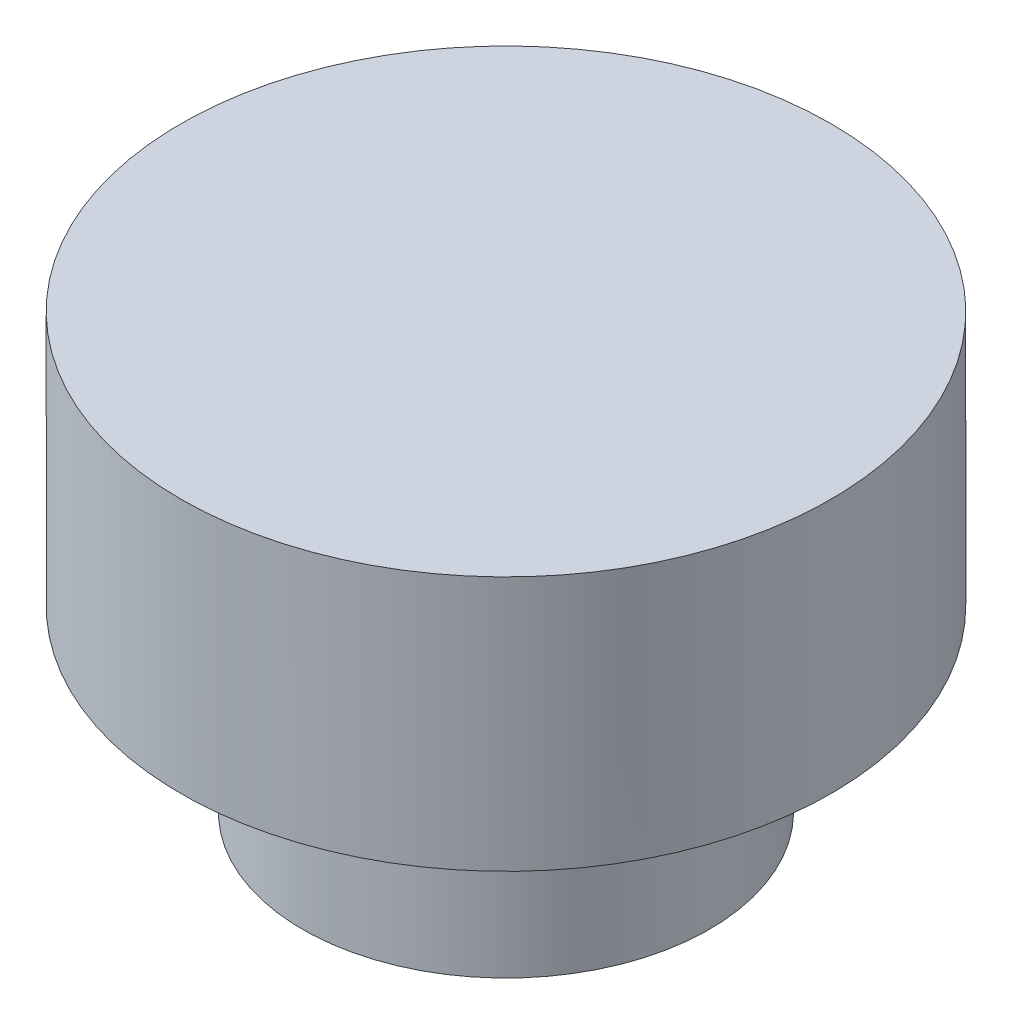
ISO-10303-21;
HEADER;
FILE_DESCRIPTION(('STEP AP214'),'2;1');
FILE_NAME('part.step','',(''),(''),'','','');
FILE_SCHEMA(('AUTOMOTIVE_DESIGN { 1 0 10303 214 1 1 1 1 }'));
ENDSEC;
DATA;
#1=APPLICATION_CONTEXT('core data for automotive mechanical design processes');
#2=APPLICATION_PROTOCOL_DEFINITION('international standard','automotive_design',2000,#1);
#3=PRODUCT_CONTEXT('',#1,'mechanical');
#4=PRODUCT('Part','Part','',(#3));
#5=PRODUCT_RELATED_PRODUCT_CATEGORY('part','',(#4));
#6=PRODUCT_DEFINITION_FORMATION('','',#4);
#7=PRODUCT_DEFINITION_CONTEXT('part definition',#1,'design');
#8=PRODUCT_DEFINITION('design','',#6,#7);
#9=PRODUCT_DEFINITION_SHAPE('','',#8);
#10=(LENGTH_UNIT() NAMED_UNIT(*) SI_UNIT(.MILLI.,.METRE.));
#11=(NAMED_UNIT(*) PLANE_ANGLE_UNIT() SI_UNIT($,.RADIAN.));
#12=(NAMED_UNIT(*) SI_UNIT($,.STERADIAN.) SOLID_ANGLE_UNIT());
#13=UNCERTAINTY_MEASURE_WITH_UNIT(LENGTH_MEASURE(1.E-05),#10,'distance_accuracy_value','');
#14=(GEOMETRIC_REPRESENTATION_CONTEXT(3) GLOBAL_UNCERTAINTY_ASSIGNED_CONTEXT((#13)) GLOBAL_UNIT_ASSIGNED_CONTEXT((#10,
#11,#12)) REPRESENTATION_CONTEXT('',''));
#15=CARTESIAN_POINT('',(0.,0.,0.));
#16=DIRECTION('',(0.,0.,1.));
#17=DIRECTION('',(1.,0.,0.));
#18=AXIS2_PLACEMENT_3D('',#15,#16,#17);
#19=CARTESIAN_POINT('',(0.,17.,0.));
#20=DIRECTION('',(0.,-1.,0.));
#21=DIRECTION('',(0.,0.,-1.));
#22=AXIS2_PLACEMENT_3D('',#19,#20,#21);
#23=CYLINDRICAL_SURFACE('',#22,12.75);
#24=CARTESIAN_POINT('',(0.,17.,0.));
#25=DIRECTION('',(0.,1.,0.));
#26=DIRECTION('',(0.,0.,1.));
#27=AXIS2_PLACEMENT_3D('',#24,#25,#26);
#28=CIRCLE('',#27,12.75);
#29=CARTESIAN_POINT('',(0.,17.,12.75));
#30=VERTEX_POINT('',#29);
#31=EDGE_CURVE('E10',#30,#30,#28,.T.);
#32=ORIENTED_EDGE('',*,*,#31,.F.);
#33=EDGE_LOOP('',(#32));
#34=FACE_BOUND('',#33,.T.);
#35=CARTESIAN_POINT('',(0.,7.,0.));
#36=DIRECTION('',(0.,-1.,0.));
#37=DIRECTION('',(0.,0.,-1.));
#38=AXIS2_PLACEMENT_3D('',#35,#36,#37);
#39=CIRCLE('',#38,12.75);
#40=CARTESIAN_POINT('',(0.,7.,-12.75));
#41=VERTEX_POINT('',#40);
#42=EDGE_CURVE('E43',#41,#41,#39,.T.);
#43=ORIENTED_EDGE('',*,*,#42,.F.);
#44=EDGE_LOOP('',(#43));
#45=FACE_BOUND('',#44,.T.);
#46=ADVANCED_FACE('F37',(#34,#45),#23,.T.);
#47=CARTESIAN_POINT('',(0.,17.,0.));
#48=DIRECTION('',(0.,1.,0.));
#49=DIRECTION('',(0.,0.,1.));
#50=AXIS2_PLACEMENT_3D('',#47,#48,#49);
#51=PLANE('',#50);
#52=ORIENTED_EDGE('',*,*,#31,.T.);
#53=EDGE_LOOP('',(#52));
#54=FACE_BOUND('',#53,.T.);
#55=ADVANCED_FACE('F68',(#54),#51,.T.);
#56=CARTESIAN_POINT('',(0.,7.,0.));
#57=DIRECTION('',(0.,-1.,0.));
#58=DIRECTION('',(0.,0.,-1.));
#59=AXIS2_PLACEMENT_3D('',#56,#57,#58);
#60=PLANE('',#59);
#61=CARTESIAN_POINT('',(0.,7.,0.));
#62=DIRECTION('',(0.,-1.,0.));
#63=DIRECTION('',(0.,0.,-1.));
#64=AXIS2_PLACEMENT_3D('',#61,#62,#63);
#65=CIRCLE('',#64,7.975);
#66=CARTESIAN_POINT('',(0.,7.,-7.975));
#67=VERTEX_POINT('',#66);
#68=EDGE_CURVE('E47',#67,#67,#65,.T.);
#69=ORIENTED_EDGE('',*,*,#68,.F.);
#70=EDGE_LOOP('',(#69));
#71=FACE_BOUND('',#70,.T.);
#72=ORIENTED_EDGE('',*,*,#42,.T.);
#73=EDGE_LOOP('',(#72));
#74=FACE_BOUND('',#73,.T.);
#75=ADVANCED_FACE('F61',(#71,#74),#60,.T.);
#76=CARTESIAN_POINT('',(0.,7.,0.));
#77=DIRECTION('',(0.,-1.,0.));
#78=DIRECTION('',(0.,0.,-1.));
#79=AXIS2_PLACEMENT_3D('',#76,#77,#78);
#80=CYLINDRICAL_SURFACE('',#79,7.975);
#81=ORIENTED_EDGE('',*,*,#68,.T.);
#82=EDGE_LOOP('',(#81));
#83=FACE_BOUND('',#82,.T.);
#84=CARTESIAN_POINT('',(0.,0.,0.));
#85=DIRECTION('',(0.,-1.,0.));
#86=DIRECTION('',(0.,0.,-1.));
#87=AXIS2_PLACEMENT_3D('',#84,#85,#86);
#88=CIRCLE('',#87,7.975);
#89=CARTESIAN_POINT('',(0.,0.,-7.975));
#90=VERTEX_POINT('',#89);
#91=EDGE_CURVE('E51',#90,#90,#88,.T.);
#92=ORIENTED_EDGE('',*,*,#91,.F.);
#93=EDGE_LOOP('',(#92));
#94=FACE_BOUND('',#93,.T.);
#95=ADVANCED_FACE('F59',(#83,#94),#80,.T.);
#96=CARTESIAN_POINT('',(0.,0.,0.));
#97=DIRECTION('',(0.,1.,0.));
#98=DIRECTION('',(0.,0.,1.));
#99=AXIS2_PLACEMENT_3D('',#96,#97,#98);
#100=PLANE('',#99);
#101=ORIENTED_EDGE('',*,*,#91,.T.);
#102=EDGE_LOOP('',(#101));
#103=FACE_BOUND('',#102,.T.);
#104=ADVANCED_FACE('F57',(#103),#100,.F.);
#105=CLOSED_SHELL('',(#46,#55,#75,#95,#104));
#106=MANIFOLD_SOLID_BREP('B2',#105);
#107=ADVANCED_BREP_SHAPE_REPRESENTATION('',(#18,#106),#14);
#108=SHAPE_DEFINITION_REPRESENTATION(#9,#107);
ENDSEC;
END-ISO-10303-21;
